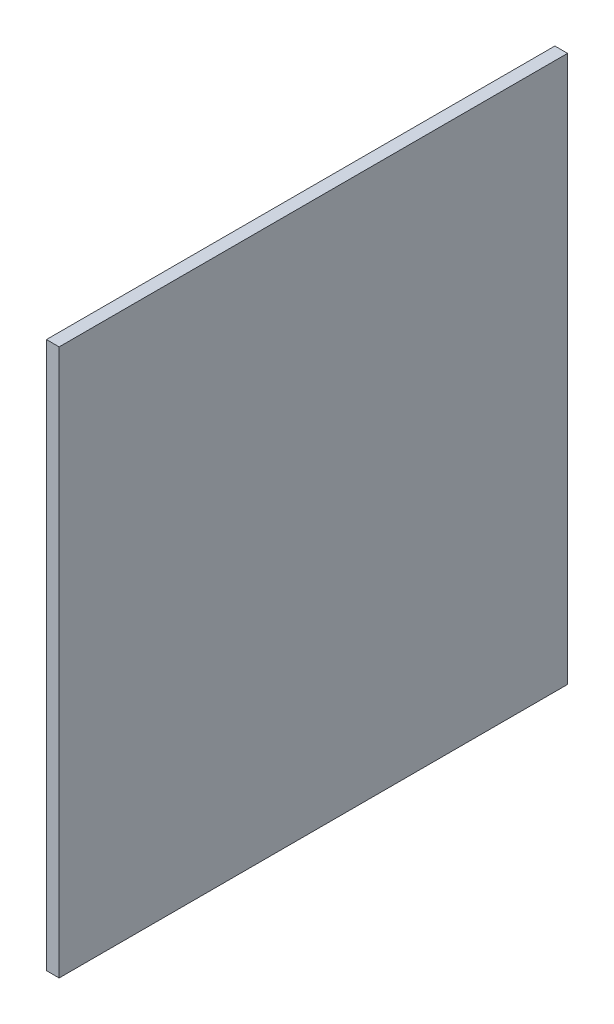
ISO-10303-21;
HEADER;
FILE_DESCRIPTION(('STEP AP214'),'2;1');
FILE_NAME('part.step','',(''),(''),'','','');
FILE_SCHEMA(('AUTOMOTIVE_DESIGN { 1 0 10303 214 1 1 1 1 }'));
ENDSEC;
DATA;
#1=APPLICATION_CONTEXT('core data for automotive mechanical design processes');
#2=APPLICATION_PROTOCOL_DEFINITION('international standard','automotive_design',2000,#1);
#3=PRODUCT_CONTEXT('',#1,'mechanical');
#4=PRODUCT('Part','Part','',(#3));
#5=PRODUCT_RELATED_PRODUCT_CATEGORY('part','',(#4));
#6=PRODUCT_DEFINITION_FORMATION('','',#4);
#7=PRODUCT_DEFINITION_CONTEXT('part definition',#1,'design');
#8=PRODUCT_DEFINITION('design','',#6,#7);
#9=PRODUCT_DEFINITION_SHAPE('','',#8);
#10=(LENGTH_UNIT() NAMED_UNIT(*) SI_UNIT(.MILLI.,.METRE.));
#11=(NAMED_UNIT(*) PLANE_ANGLE_UNIT() SI_UNIT($,.RADIAN.));
#12=(NAMED_UNIT(*) SI_UNIT($,.STERADIAN.) SOLID_ANGLE_UNIT());
#13=UNCERTAINTY_MEASURE_WITH_UNIT(LENGTH_MEASURE(1.E-05),#10,'distance_accuracy_value','');
#14=(GEOMETRIC_REPRESENTATION_CONTEXT(3) GLOBAL_UNCERTAINTY_ASSIGNED_CONTEXT((#13)) GLOBAL_UNIT_ASSIGNED_CONTEXT((#10,
#11,#12)) REPRESENTATION_CONTEXT('',''));
#15=CARTESIAN_POINT('',(0.,0.,0.));
#16=DIRECTION('',(0.,0.,1.));
#17=DIRECTION('',(1.,0.,0.));
#18=AXIS2_PLACEMENT_3D('',#15,#16,#17);
#19=CARTESIAN_POINT('',(5.,0.,0.));
#20=DIRECTION('',(0.,0.,-1.));
#21=DIRECTION('',(-1.,0.,0.));
#22=AXIS2_PLACEMENT_3D('',#19,#20,#21);
#23=PLANE('',#22);
#24=DIRECTION('',(0.,-1.,0.));
#25=VECTOR('',#24,1.);
#26=CARTESIAN_POINT('',(0.,0.,0.));
#27=LINE('',#26,#25);
#28=CARTESIAN_POINT('',(0.,215.,0.));
#29=VERTEX_POINT('',#28);
#30=CARTESIAN_POINT('',(0.,0.,0.));
#31=VERTEX_POINT('',#30);
#32=EDGE_CURVE('E98',#29,#31,#27,.T.);
#33=ORIENTED_EDGE('',*,*,#32,.T.);
#34=DIRECTION('',(-1.,0.,0.));
#35=VECTOR('',#34,1.);
#36=CARTESIAN_POINT('',(5.,0.,0.));
#37=LINE('',#36,#35);
#38=CARTESIAN_POINT('',(5.,0.,0.));
#39=VERTEX_POINT('',#38);
#40=EDGE_CURVE('E11',#39,#31,#37,.T.);
#41=ORIENTED_EDGE('',*,*,#40,.F.);
#42=DIRECTION('',(0.,-1.,0.));
#43=VECTOR('',#42,1.);
#44=CARTESIAN_POINT('',(5.,0.,0.));
#45=LINE('',#44,#43);
#46=CARTESIAN_POINT('',(5.,215.,0.));
#47=VERTEX_POINT('',#46);
#48=EDGE_CURVE('E86',#47,#39,#45,.T.);
#49=ORIENTED_EDGE('',*,*,#48,.F.);
#50=DIRECTION('',(-1.,0.,0.));
#51=VECTOR('',#50,1.);
#52=CARTESIAN_POINT('',(5.,215.,0.));
#53=LINE('',#52,#51);
#54=EDGE_CURVE('E94',#47,#29,#53,.T.);
#55=ORIENTED_EDGE('',*,*,#54,.T.);
#56=EDGE_LOOP('',(#33,#41,#49,#55));
#57=FACE_BOUND('',#56,.T.);
#58=ADVANCED_FACE('F35',(#57),#23,.F.);
#59=CARTESIAN_POINT('',(5.,0.,0.));
#60=DIRECTION('',(0.,1.,0.));
#61=DIRECTION('',(0.,0.,1.));
#62=AXIS2_PLACEMENT_3D('',#59,#60,#61);
#63=PLANE('',#62);
#64=DIRECTION('',(0.,0.,-1.));
#65=VECTOR('',#64,1.);
#66=CARTESIAN_POINT('',(0.,0.,0.));
#67=LINE('',#66,#65);
#68=CARTESIAN_POINT('',(0.,0.,-200.));
#69=VERTEX_POINT('',#68);
#70=EDGE_CURVE('E90',#31,#69,#67,.T.);
#71=ORIENTED_EDGE('',*,*,#70,.T.);
#72=DIRECTION('',(-1.,0.,0.));
#73=VECTOR('',#72,1.);
#74=CARTESIAN_POINT('',(5.,0.,-200.));
#75=LINE('',#74,#73);
#76=CARTESIAN_POINT('',(5.,0.,-200.));
#77=VERTEX_POINT('',#76);
#78=EDGE_CURVE('E43',#77,#69,#75,.T.);
#79=ORIENTED_EDGE('',*,*,#78,.F.);
#80=DIRECTION('',(0.,0.,-1.));
#81=VECTOR('',#80,1.);
#82=CARTESIAN_POINT('',(5.,0.,0.));
#83=LINE('',#82,#81);
#84=EDGE_CURVE('E81',#39,#77,#83,.T.);
#85=ORIENTED_EDGE('',*,*,#84,.F.);
#86=ORIENTED_EDGE('',*,*,#40,.T.);
#87=EDGE_LOOP('',(#71,#79,#85,#86));
#88=FACE_BOUND('',#87,.T.);
#89=ADVANCED_FACE('F89',(#88),#63,.F.);
#90=CARTESIAN_POINT('',(5.,0.,-200.));
#91=DIRECTION('',(0.,0.,1.));
#92=DIRECTION('',(1.,0.,0.));
#93=AXIS2_PLACEMENT_3D('',#90,#91,#92);
#94=PLANE('',#93);
#95=DIRECTION('',(0.,1.,0.));
#96=VECTOR('',#95,1.);
#97=CARTESIAN_POINT('',(0.,0.,-200.));
#98=LINE('',#97,#96);
#99=CARTESIAN_POINT('',(0.,215.,-200.));
#100=VERTEX_POINT('',#99);
#101=EDGE_CURVE('E68',#69,#100,#98,.T.);
#102=ORIENTED_EDGE('',*,*,#101,.T.);
#103=DIRECTION('',(-1.,0.,0.));
#104=VECTOR('',#103,1.);
#105=CARTESIAN_POINT('',(5.,215.,-200.));
#106=LINE('',#105,#104);
#107=CARTESIAN_POINT('',(5.,215.,-200.));
#108=VERTEX_POINT('',#107);
#109=EDGE_CURVE('E91',#108,#100,#106,.T.);
#110=ORIENTED_EDGE('',*,*,#109,.F.);
#111=DIRECTION('',(0.,1.,0.));
#112=VECTOR('',#111,1.);
#113=CARTESIAN_POINT('',(5.,0.,-200.));
#114=LINE('',#113,#112);
#115=EDGE_CURVE('E84',#77,#108,#114,.T.);
#116=ORIENTED_EDGE('',*,*,#115,.F.);
#117=ORIENTED_EDGE('',*,*,#78,.T.);
#118=EDGE_LOOP('',(#102,#110,#116,#117));
#119=FACE_BOUND('',#118,.T.);
#120=ADVANCED_FACE('F92',(#119),#94,.F.);
#121=CARTESIAN_POINT('',(5.,215.,0.));
#122=DIRECTION('',(0.,-1.,0.));
#123=DIRECTION('',(0.,0.,-1.));
#124=AXIS2_PLACEMENT_3D('',#121,#122,#123);
#125=PLANE('',#124);
#126=DIRECTION('',(0.,0.,1.));
#127=VECTOR('',#126,1.);
#128=CARTESIAN_POINT('',(0.,215.,0.));
#129=LINE('',#128,#127);
#130=EDGE_CURVE('E74',#100,#29,#129,.T.);
#131=ORIENTED_EDGE('',*,*,#130,.T.);
#132=ORIENTED_EDGE('',*,*,#54,.F.);
#133=DIRECTION('',(0.,0.,1.));
#134=VECTOR('',#133,1.);
#135=CARTESIAN_POINT('',(5.,215.,0.));
#136=LINE('',#135,#134);
#137=EDGE_CURVE('E51',#108,#47,#136,.T.);
#138=ORIENTED_EDGE('',*,*,#137,.F.);
#139=ORIENTED_EDGE('',*,*,#109,.T.);
#140=EDGE_LOOP('',(#131,#132,#138,#139));
#141=FACE_BOUND('',#140,.T.);
#142=ADVANCED_FACE('F105',(#141),#125,.F.);
#143=CARTESIAN_POINT('',(5.,0.,0.));
#144=DIRECTION('',(-1.,0.,0.));
#145=DIRECTION('',(0.,0.,1.));
#146=AXIS2_PLACEMENT_3D('',#143,#144,#145);
#147=PLANE('',#146);
#148=ORIENTED_EDGE('',*,*,#48,.T.);
#149=ORIENTED_EDGE('',*,*,#84,.T.);
#150=ORIENTED_EDGE('',*,*,#115,.T.);
#151=ORIENTED_EDGE('',*,*,#137,.T.);
#152=EDGE_LOOP('',(#148,#149,#150,#151));
#153=FACE_BOUND('',#152,.T.);
#154=ADVANCED_FACE('F82',(#153),#147,.F.);
#155=CARTESIAN_POINT('',(0.,0.,0.));
#156=DIRECTION('',(-1.,0.,0.));
#157=DIRECTION('',(0.,0.,1.));
#158=AXIS2_PLACEMENT_3D('',#155,#156,#157);
#159=PLANE('',#158);
#160=ORIENTED_EDGE('',*,*,#32,.F.);
#161=ORIENTED_EDGE('',*,*,#130,.F.);
#162=ORIENTED_EDGE('',*,*,#101,.F.);
#163=ORIENTED_EDGE('',*,*,#70,.F.);
#164=EDGE_LOOP('',(#160,#161,#162,#163));
#165=FACE_BOUND('',#164,.T.);
#166=ADVANCED_FACE('F108',(#165),#159,.T.);
#167=CLOSED_SHELL('',(#58,#89,#120,#142,#154,#166));
#168=MANIFOLD_SOLID_BREP('B2',#167);
#169=ADVANCED_BREP_SHAPE_REPRESENTATION('',(#18,#168),#14);
#170=SHAPE_DEFINITION_REPRESENTATION(#9,#169);
ENDSEC;
END-ISO-10303-21;
